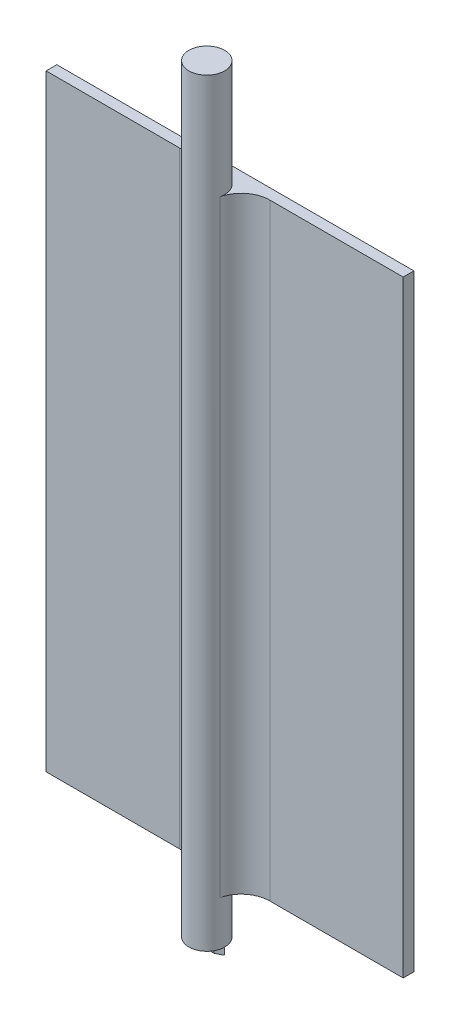
ISO-10303-21;
HEADER;
FILE_DESCRIPTION(('STEP AP214'),'2;1');
FILE_NAME('part.step','',(''),(''),'','','');
FILE_SCHEMA(('AUTOMOTIVE_DESIGN { 1 0 10303 214 1 1 1 1 }'));
ENDSEC;
DATA;
#1=APPLICATION_CONTEXT('core data for automotive mechanical design processes');
#2=APPLICATION_PROTOCOL_DEFINITION('international standard','automotive_design',2000,#1);
#3=PRODUCT_CONTEXT('',#1,'mechanical');
#4=PRODUCT('Part','Part','',(#3));
#5=PRODUCT_RELATED_PRODUCT_CATEGORY('part','',(#4));
#6=PRODUCT_DEFINITION_FORMATION('','',#4);
#7=PRODUCT_DEFINITION_CONTEXT('part definition',#1,'design');
#8=PRODUCT_DEFINITION('design','',#6,#7);
#9=PRODUCT_DEFINITION_SHAPE('','',#8);
#10=(LENGTH_UNIT() NAMED_UNIT(*) SI_UNIT(.MILLI.,.METRE.));
#11=(NAMED_UNIT(*) PLANE_ANGLE_UNIT() SI_UNIT($,.RADIAN.));
#12=(NAMED_UNIT(*) SI_UNIT($,.STERADIAN.) SOLID_ANGLE_UNIT());
#13=UNCERTAINTY_MEASURE_WITH_UNIT(LENGTH_MEASURE(1.E-05),#10,'distance_accuracy_value','');
#14=(GEOMETRIC_REPRESENTATION_CONTEXT(3) GLOBAL_UNCERTAINTY_ASSIGNED_CONTEXT((#13)) GLOBAL_UNIT_ASSIGNED_CONTEXT((#10,
#11,#12)) REPRESENTATION_CONTEXT('',''));
#15=CARTESIAN_POINT('',(0.,0.,0.));
#16=DIRECTION('',(0.,0.,1.));
#17=DIRECTION('',(1.,0.,0.));
#18=AXIS2_PLACEMENT_3D('',#15,#16,#17);
#19=CARTESIAN_POINT('',(50.,-12.5,8.));
#20=DIRECTION('',(0.,-1.,0.));
#21=DIRECTION('',(0.,0.,-1.));
#22=AXIS2_PLACEMENT_3D('',#19,#20,#21);
#23=PLANE('',#22);
#24=DIRECTION('',(-0.894427190999917,0.,0.447213595499956));
#25=VECTOR('',#24,1.);
#26=CARTESIAN_POINT('',(53.,-12.5,9.));
#27=LINE('',#26,#25);
#28=CARTESIAN_POINT('',(55.,-12.5,8.));
#29=VERTEX_POINT('',#28);
#30=CARTESIAN_POINT('',(53.,-12.5,9.));
#31=VERTEX_POINT('',#30);
#32=EDGE_CURVE('E170',#29,#31,#27,.T.);
#33=ORIENTED_EDGE('',*,*,#32,.F.);
#34=CARTESIAN_POINT('',(50.,-12.5,8.));
#35=DIRECTION('',(0.,-1.,0.));
#36=DIRECTION('',(0.,0.,-1.));
#37=AXIS2_PLACEMENT_3D('',#34,#35,#36);
#38=CIRCLE('',#37,5.);
#39=CARTESIAN_POINT('',(45.,-12.5,8.));
#40=VERTEX_POINT('',#39);
#41=EDGE_CURVE('E176',#29,#40,#38,.T.);
#42=ORIENTED_EDGE('',*,*,#41,.T.);
#43=DIRECTION('',(-0.894427190999916,0.,-0.447213595499957));
#44=VECTOR('',#43,1.);
#45=CARTESIAN_POINT('',(47.,-12.5,9.));
#46=LINE('',#45,#44);
#47=CARTESIAN_POINT('',(47.,-12.5,9.));
#48=VERTEX_POINT('',#47);
#49=EDGE_CURVE('E496',#48,#40,#46,.T.);
#50=ORIENTED_EDGE('',*,*,#49,.F.);
#51=DIRECTION('',(-1.,0.,0.));
#52=VECTOR('',#51,1.);
#53=CARTESIAN_POINT('',(47.,-12.5,9.));
#54=LINE('',#53,#52);
#55=EDGE_CURVE('E498',#31,#48,#54,.T.);
#56=ORIENTED_EDGE('',*,*,#55,.F.);
#57=EDGE_LOOP('',(#33,#42,#50,#56));
#58=FACE_BOUND('',#57,.T.);
#59=ADVANCED_FACE('F45',(#58),#23,.T.);
#60=CARTESIAN_POINT('',(0.,170.,3.));
#61=DIRECTION('',(0.,-1.,0.));
#62=DIRECTION('',(0.,0.,-1.));
#63=AXIS2_PLACEMENT_3D('',#60,#61,#62);
#64=PLANE('',#63);
#65=CARTESIAN_POINT('',(50.,170.,8.));
#66=DIRECTION('',(0.,1.,0.));
#67=DIRECTION('',(0.,0.,1.));
#68=AXIS2_PLACEMENT_3D('',#65,#66,#67);
#69=CIRCLE('',#68,5.);
#70=CARTESIAN_POINT('',(54.8650425541052,170.,9.15384615384615));
#71=VERTEX_POINT('',#70);
#72=CARTESIAN_POINT('',(45.1349574458948,170.,9.15384615384615));
#73=VERTEX_POINT('',#72);
#74=EDGE_CURVE('E184',#71,#73,#69,.T.);
#75=ORIENTED_EDGE('',*,*,#74,.F.);
#76=CARTESIAN_POINT('',(62.6491106406735,170.,11.));
#77=DIRECTION('',(0.,-1.,0.));
#78=DIRECTION('',(0.,0.,-1.));
#79=AXIS2_PLACEMENT_3D('',#76,#77,#78);
#80=CIRCLE('',#79,8.);
#81=CARTESIAN_POINT('',(62.6491106406735,170.,3.));
#82=VERTEX_POINT('',#81);
#83=EDGE_CURVE('E255',#71,#82,#80,.T.);
#84=ORIENTED_EDGE('',*,*,#83,.T.);
#85=DIRECTION('',(-1.,0.,0.));
#86=VECTOR('',#85,1.);
#87=CARTESIAN_POINT('',(0.,170.,3.));
#88=LINE('',#87,#86);
#89=CARTESIAN_POINT('',(100.,170.,3.));
#90=VERTEX_POINT('',#89);
#91=EDGE_CURVE('E211',#90,#82,#88,.T.);
#92=ORIENTED_EDGE('',*,*,#91,.F.);
#93=DIRECTION('',(0.,0.,-1.));
#94=VECTOR('',#93,1.);
#95=CARTESIAN_POINT('',(100.,170.,3.));
#96=LINE('',#95,#94);
#97=CARTESIAN_POINT('',(100.,170.,0.));
#98=VERTEX_POINT('',#97);
#99=EDGE_CURVE('E230',#90,#98,#96,.T.);
#100=ORIENTED_EDGE('',*,*,#99,.T.);
#101=DIRECTION('',(-1.,0.,0.));
#102=VECTOR('',#101,1.);
#103=CARTESIAN_POINT('',(0.,170.,0.));
#104=LINE('',#103,#102);
#105=CARTESIAN_POINT('',(0.,170.,0.));
#106=VERTEX_POINT('',#105);
#107=EDGE_CURVE('E202',#98,#106,#104,.T.);
#108=ORIENTED_EDGE('',*,*,#107,.T.);
#109=DIRECTION('',(0.,0.,-1.));
#110=VECTOR('',#109,1.);
#111=CARTESIAN_POINT('',(0.,170.,3.));
#112=LINE('',#111,#110);
#113=CARTESIAN_POINT('',(0.,170.,3.));
#114=VERTEX_POINT('',#113);
#115=EDGE_CURVE('E215',#114,#106,#112,.T.);
#116=ORIENTED_EDGE('',*,*,#115,.F.);
#117=CARTESIAN_POINT('',(37.3508893593265,170.,3.));
#118=VERTEX_POINT('',#117);
#119=EDGE_CURVE('E210',#118,#114,#88,.T.);
#120=ORIENTED_EDGE('',*,*,#119,.F.);
#121=CARTESIAN_POINT('',(37.3508893593265,170.,11.));
#122=DIRECTION('',(0.,-1.,0.));
#123=DIRECTION('',(0.,0.,-1.));
#124=AXIS2_PLACEMENT_3D('',#121,#122,#123);
#125=CIRCLE('',#124,8.);
#126=EDGE_CURVE('E54',#118,#73,#125,.T.);
#127=ORIENTED_EDGE('',*,*,#126,.T.);
#128=EDGE_LOOP('',(#75,#84,#92,#100,#108,#116,#120,#127));
#129=FACE_BOUND('',#128,.T.);
#130=ADVANCED_FACE('F266',(#129),#64,.F.);
#131=CARTESIAN_POINT('',(0.,0.,3.));
#132=DIRECTION('',(0.,0.,-1.));
#133=DIRECTION('',(-1.,0.,0.));
#134=AXIS2_PLACEMENT_3D('',#131,#132,#133);
#135=PLANE('',#134);
#136=ORIENTED_EDGE('',*,*,#91,.T.);
#137=DIRECTION('',(0.,1.,0.));
#138=VECTOR('',#137,1.);
#139=CARTESIAN_POINT('',(62.6491106406735,0.,3.));
#140=LINE('',#139,#138);
#141=CARTESIAN_POINT('',(62.6491106406735,0.,3.));
#142=VERTEX_POINT('',#141);
#143=EDGE_CURVE('E248',#82,#142,#140,.F.);
#144=ORIENTED_EDGE('',*,*,#143,.T.);
#145=DIRECTION('',(1.,0.,0.));
#146=VECTOR('',#145,1.);
#147=CARTESIAN_POINT('',(0.,0.,3.));
#148=LINE('',#147,#146);
#149=CARTESIAN_POINT('',(100.,0.,3.));
#150=VERTEX_POINT('',#149);
#151=EDGE_CURVE('E201',#142,#150,#148,.T.);
#152=ORIENTED_EDGE('',*,*,#151,.T.);
#153=DIRECTION('',(0.,1.,0.));
#154=VECTOR('',#153,1.);
#155=CARTESIAN_POINT('',(100.,0.,3.));
#156=LINE('',#155,#154);
#157=EDGE_CURVE('E207',#150,#90,#156,.T.);
#158=ORIENTED_EDGE('',*,*,#157,.T.);
#159=EDGE_LOOP('',(#136,#144,#152,#158));
#160=FACE_BOUND('',#159,.T.);
#161=ADVANCED_FACE('F282',(#160),#135,.F.);
#162=CARTESIAN_POINT('',(0.,0.,3.));
#163=DIRECTION('',(1.,0.,0.));
#164=DIRECTION('',(0.,0.,-1.));
#165=AXIS2_PLACEMENT_3D('',#162,#163,#164);
#166=PLANE('',#165);
#167=DIRECTION('',(0.,-1.,0.));
#168=VECTOR('',#167,1.);
#169=CARTESIAN_POINT('',(0.,0.,0.));
#170=LINE('',#169,#168);
#171=CARTESIAN_POINT('',(0.,0.,0.));
#172=VERTEX_POINT('',#171);
#173=EDGE_CURVE('E194',#106,#172,#170,.T.);
#174=ORIENTED_EDGE('',*,*,#173,.T.);
#175=DIRECTION('',(0.,0.,-1.));
#176=VECTOR('',#175,1.);
#177=CARTESIAN_POINT('',(0.,0.,3.));
#178=LINE('',#177,#176);
#179=CARTESIAN_POINT('',(0.,0.,3.));
#180=VERTEX_POINT('',#179);
#181=EDGE_CURVE('E189',#180,#172,#178,.T.);
#182=ORIENTED_EDGE('',*,*,#181,.F.);
#183=DIRECTION('',(0.,-1.,0.));
#184=VECTOR('',#183,1.);
#185=CARTESIAN_POINT('',(0.,0.,3.));
#186=LINE('',#185,#184);
#187=EDGE_CURVE('E197',#114,#180,#186,.T.);
#188=ORIENTED_EDGE('',*,*,#187,.F.);
#189=ORIENTED_EDGE('',*,*,#115,.T.);
#190=EDGE_LOOP('',(#174,#182,#188,#189));
#191=FACE_BOUND('',#190,.T.);
#192=ADVANCED_FACE('F296',(#191),#166,.F.);
#193=CARTESIAN_POINT('',(0.,0.,3.));
#194=DIRECTION('',(0.,1.,0.));
#195=DIRECTION('',(0.,0.,1.));
#196=AXIS2_PLACEMENT_3D('',#193,#194,#195);
#197=PLANE('',#196);
#198=CARTESIAN_POINT('',(50.,0.,8.));
#199=DIRECTION('',(0.,-1.,0.));
#200=DIRECTION('',(0.,0.,-1.));
#201=AXIS2_PLACEMENT_3D('',#198,#199,#200);
#202=CIRCLE('',#201,5.);
#203=CARTESIAN_POINT('',(45.1349574458948,0.,9.15384615384616));
#204=VERTEX_POINT('',#203);
#205=CARTESIAN_POINT('',(54.8650425541052,0.,9.15384615384615));
#206=VERTEX_POINT('',#205);
#207=EDGE_CURVE('E185',#204,#206,#202,.T.);
#208=ORIENTED_EDGE('',*,*,#207,.F.);
#209=CARTESIAN_POINT('',(37.3508893593265,0.,11.));
#210=DIRECTION('',(0.,1.,0.));
#211=DIRECTION('',(0.,0.,1.));
#212=AXIS2_PLACEMENT_3D('',#209,#210,#211);
#213=CIRCLE('',#212,8.);
#214=CARTESIAN_POINT('',(37.3508893593265,0.,3.));
#215=VERTEX_POINT('',#214);
#216=EDGE_CURVE('E11',#204,#215,#213,.T.);
#217=ORIENTED_EDGE('',*,*,#216,.T.);
#218=EDGE_CURVE('E203',#180,#215,#148,.T.);
#219=ORIENTED_EDGE('',*,*,#218,.F.);
#220=ORIENTED_EDGE('',*,*,#181,.T.);
#221=DIRECTION('',(1.,0.,0.));
#222=VECTOR('',#221,1.);
#223=CARTESIAN_POINT('',(0.,0.,0.));
#224=LINE('',#223,#222);
#225=CARTESIAN_POINT('',(100.,0.,0.));
#226=VERTEX_POINT('',#225);
#227=EDGE_CURVE('E219',#172,#226,#224,.T.);
#228=ORIENTED_EDGE('',*,*,#227,.T.);
#229=DIRECTION('',(0.,0.,-1.));
#230=VECTOR('',#229,1.);
#231=CARTESIAN_POINT('',(100.,0.,3.));
#232=LINE('',#231,#230);
#233=EDGE_CURVE('E234',#150,#226,#232,.T.);
#234=ORIENTED_EDGE('',*,*,#233,.F.);
#235=ORIENTED_EDGE('',*,*,#151,.F.);
#236=CARTESIAN_POINT('',(62.6491106406735,0.,11.));
#237=DIRECTION('',(0.,1.,0.));
#238=DIRECTION('',(0.,0.,1.));
#239=AXIS2_PLACEMENT_3D('',#236,#237,#238);
#240=CIRCLE('',#239,8.);
#241=EDGE_CURVE('E258',#142,#206,#240,.T.);
#242=ORIENTED_EDGE('',*,*,#241,.T.);
#243=EDGE_LOOP('',(#208,#217,#219,#220,#228,#234,#235,#242));
#244=FACE_BOUND('',#243,.T.);
#245=ADVANCED_FACE('F303',(#244),#197,.F.);
#246=CARTESIAN_POINT('',(100.,0.,3.));
#247=DIRECTION('',(-1.,0.,0.));
#248=DIRECTION('',(0.,0.,1.));
#249=AXIS2_PLACEMENT_3D('',#246,#247,#248);
#250=PLANE('',#249);
#251=DIRECTION('',(0.,1.,0.));
#252=VECTOR('',#251,1.);
#253=CARTESIAN_POINT('',(100.,0.,0.));
#254=LINE('',#253,#252);
#255=EDGE_CURVE('E222',#226,#98,#254,.T.);
#256=ORIENTED_EDGE('',*,*,#255,.T.);
#257=ORIENTED_EDGE('',*,*,#99,.F.);
#258=ORIENTED_EDGE('',*,*,#157,.F.);
#259=ORIENTED_EDGE('',*,*,#233,.T.);
#260=EDGE_LOOP('',(#256,#257,#258,#259));
#261=FACE_BOUND('',#260,.T.);
#262=ADVANCED_FACE('F288',(#261),#250,.F.);
#263=ORIENTED_EDGE('',*,*,#218,.T.);
#264=DIRECTION('',(0.,1.,0.));
#265=VECTOR('',#264,1.);
#266=CARTESIAN_POINT('',(37.3508893593265,0.,3.));
#267=LINE('',#266,#265);
#268=EDGE_CURVE('E251',#215,#118,#267,.T.);
#269=ORIENTED_EDGE('',*,*,#268,.T.);
#270=ORIENTED_EDGE('',*,*,#119,.T.);
#271=ORIENTED_EDGE('',*,*,#187,.T.);
#272=EDGE_LOOP('',(#263,#269,#270,#271));
#273=FACE_BOUND('',#272,.T.);
#274=ADVANCED_FACE('F299',(#273),#135,.F.);
#275=CARTESIAN_POINT('',(0.,0.,0.));
#276=DIRECTION('',(0.,0.,-1.));
#277=DIRECTION('',(-1.,0.,0.));
#278=AXIS2_PLACEMENT_3D('',#275,#276,#277);
#279=PLANE('',#278);
#280=ORIENTED_EDGE('',*,*,#173,.F.);
#281=ORIENTED_EDGE('',*,*,#107,.F.);
#282=ORIENTED_EDGE('',*,*,#255,.F.);
#283=ORIENTED_EDGE('',*,*,#227,.F.);
#284=EDGE_LOOP('',(#280,#281,#282,#283));
#285=FACE_BOUND('',#284,.T.);
#286=ADVANCED_FACE('F293',(#285),#279,.T.);
#287=CARTESIAN_POINT('',(50.,-14.142135623731,8.));
#288=DIRECTION('',(0.,1.,0.));
#289=DIRECTION('',(0.,0.,1.));
#290=AXIS2_PLACEMENT_3D('',#287,#288,#289);
#291=CYLINDRICAL_SURFACE('',#290,5.);
#292=DIRECTION('',(0.,1.,0.));
#293=VECTOR('',#292,1.);
#294=CARTESIAN_POINT('',(54.8650425541052,-14.142135623731,9.15384615384615));
#295=LINE('',#294,#293);
#296=EDGE_CURVE('E244',#206,#71,#295,.T.);
#297=ORIENTED_EDGE('',*,*,#296,.T.);
#298=ORIENTED_EDGE('',*,*,#74,.T.);
#299=DIRECTION('',(0.,1.,0.));
#300=VECTOR('',#299,1.);
#301=CARTESIAN_POINT('',(45.1349574458948,-14.142135623731,9.15384615384616));
#302=LINE('',#301,#300);
#303=EDGE_CURVE('E188',#73,#204,#302,.F.);
#304=ORIENTED_EDGE('',*,*,#303,.T.);
#305=ORIENTED_EDGE('',*,*,#207,.T.);
#306=EDGE_LOOP('',(#297,#298,#304,#305));
#307=FACE_BOUND('',#306,.T.);
#308=CARTESIAN_POINT('',(50.,200.,8.));
#309=DIRECTION('',(0.,1.,0.));
#310=DIRECTION('',(0.,0.,1.));
#311=AXIS2_PLACEMENT_3D('',#308,#309,#310);
#312=CIRCLE('',#311,5.);
#313=CARTESIAN_POINT('',(50.,200.,13.));
#314=VERTEX_POINT('',#313);
#315=EDGE_CURVE('E190',#314,#314,#312,.T.);
#316=ORIENTED_EDGE('',*,*,#315,.F.);
#317=EDGE_LOOP('',(#316));
#318=FACE_BOUND('',#317,.T.);
#319=ORIENTED_EDGE('',*,*,#41,.F.);
#320=EDGE_CURVE('E172',#40,#29,#38,.T.);
#321=ORIENTED_EDGE('',*,*,#320,.F.);
#322=EDGE_LOOP('',(#319,#321));
#323=FACE_BOUND('',#322,.T.);
#324=ADVANCED_FACE('F273',(#307,#318,#323),#291,.T.);
#325=CARTESIAN_POINT('',(50.,200.,8.));
#326=DIRECTION('',(0.,1.,0.));
#327=DIRECTION('',(0.,0.,1.));
#328=AXIS2_PLACEMENT_3D('',#325,#326,#327);
#329=PLANE('',#328);
#330=ORIENTED_EDGE('',*,*,#315,.T.);
#331=EDGE_LOOP('',(#330));
#332=FACE_BOUND('',#331,.T.);
#333=ADVANCED_FACE('F327',(#332),#329,.T.);
#334=DIRECTION('',(0.894427190999916,0.,0.447213595499957));
#335=VECTOR('',#334,1.);
#336=CARTESIAN_POINT('',(55.,-12.5,8.));
#337=LINE('',#336,#335);
#338=CARTESIAN_POINT('',(53.,-12.5,7.));
#339=VERTEX_POINT('',#338);
#340=EDGE_CURVE('E61',#339,#29,#337,.T.);
#341=ORIENTED_EDGE('',*,*,#340,.F.);
#342=DIRECTION('',(1.,0.,0.));
#343=VECTOR('',#342,1.);
#344=CARTESIAN_POINT('',(47.,-12.5,7.));
#345=LINE('',#344,#343);
#346=CARTESIAN_POINT('',(47.,-12.5,7.));
#347=VERTEX_POINT('',#346);
#348=EDGE_CURVE('E65',#347,#339,#345,.T.);
#349=ORIENTED_EDGE('',*,*,#348,.F.);
#350=DIRECTION('',(0.894427190999916,0.,-0.447213595499958));
#351=VECTOR('',#350,1.);
#352=CARTESIAN_POINT('',(45.,-12.5,8.));
#353=LINE('',#352,#351);
#354=EDGE_CURVE('E493',#40,#347,#353,.T.);
#355=ORIENTED_EDGE('',*,*,#354,.F.);
#356=ORIENTED_EDGE('',*,*,#320,.T.);
#357=EDGE_LOOP('',(#341,#349,#355,#356));
#358=FACE_BOUND('',#357,.T.);
#359=ADVANCED_FACE('F317',(#358),#23,.T.);
#360=CARTESIAN_POINT('',(62.6491106406735,-14.142135623731,11.));
#361=DIRECTION('',(0.,1.,0.));
#362=DIRECTION('',(0.,0.,1.));
#363=AXIS2_PLACEMENT_3D('',#360,#361,#362);
#364=CYLINDRICAL_SURFACE('',#363,8.);
#365=ORIENTED_EDGE('',*,*,#241,.F.);
#366=ORIENTED_EDGE('',*,*,#143,.F.);
#367=ORIENTED_EDGE('',*,*,#83,.F.);
#368=ORIENTED_EDGE('',*,*,#296,.F.);
#369=EDGE_LOOP('',(#365,#366,#367,#368));
#370=FACE_BOUND('',#369,.T.);
#371=ADVANCED_FACE('F278',(#370),#364,.F.);
#372=CARTESIAN_POINT('',(37.3508893593265,-14.142135623731,11.));
#373=DIRECTION('',(0.,1.,0.));
#374=DIRECTION('',(0.,0.,1.));
#375=AXIS2_PLACEMENT_3D('',#372,#373,#374);
#376=CYLINDRICAL_SURFACE('',#375,8.);
#377=ORIENTED_EDGE('',*,*,#216,.F.);
#378=ORIENTED_EDGE('',*,*,#303,.F.);
#379=ORIENTED_EDGE('',*,*,#126,.F.);
#380=ORIENTED_EDGE('',*,*,#268,.F.);
#381=EDGE_LOOP('',(#377,#378,#379,#380));
#382=FACE_BOUND('',#381,.T.);
#383=ADVANCED_FACE('F47',(#382),#376,.F.);
#384=CARTESIAN_POINT('',(53.,-14.5,9.));
#385=DIRECTION('',(-0.447213595499956,0.,-0.894427190999917));
#386=DIRECTION('',(-0.894427190999917,0.,0.447213595499956));
#387=AXIS2_PLACEMENT_3D('',#384,#385,#386);
#388=PLANE('',#387);
#389=ORIENTED_EDGE('',*,*,#32,.T.);
#390=DIRECTION('',(0.,1.,0.));
#391=VECTOR('',#390,1.);
#392=CARTESIAN_POINT('',(53.,-14.5,9.));
#393=LINE('',#392,#391);
#394=CARTESIAN_POINT('',(53.,-14.5,9.));
#395=VERTEX_POINT('',#394);
#396=EDGE_CURVE('E150',#395,#31,#393,.T.);
#397=ORIENTED_EDGE('',*,*,#396,.F.);
#398=DIRECTION('',(-0.894427190999917,0.,0.447213595499956));
#399=VECTOR('',#398,1.);
#400=CARTESIAN_POINT('',(53.,-14.5,9.));
#401=LINE('',#400,#399);
#402=CARTESIAN_POINT('',(55.,-14.5,8.));
#403=VERTEX_POINT('',#402);
#404=EDGE_CURVE('E158',#403,#395,#401,.T.);
#405=ORIENTED_EDGE('',*,*,#404,.F.);
#406=DIRECTION('',(0.,1.,0.));
#407=VECTOR('',#406,1.);
#408=CARTESIAN_POINT('',(55.,-14.5,8.));
#409=LINE('',#408,#407);
#410=EDGE_CURVE('E471',#403,#29,#409,.T.);
#411=ORIENTED_EDGE('',*,*,#410,.T.);
#412=EDGE_LOOP('',(#389,#397,#405,#411));
#413=FACE_BOUND('',#412,.T.);
#414=ADVANCED_FACE('F169',(#413),#388,.F.);
#415=CARTESIAN_POINT('',(47.,-14.5,9.));
#416=DIRECTION('',(0.,0.,-1.));
#417=DIRECTION('',(-1.,0.,0.));
#418=AXIS2_PLACEMENT_3D('',#415,#416,#417);
#419=PLANE('',#418);
#420=ORIENTED_EDGE('',*,*,#55,.T.);
#421=DIRECTION('',(0.,1.,0.));
#422=VECTOR('',#421,1.);
#423=CARTESIAN_POINT('',(47.,-14.5,9.));
#424=LINE('',#423,#422);
#425=CARTESIAN_POINT('',(47.,-14.5,9.));
#426=VERTEX_POINT('',#425);
#427=EDGE_CURVE('E153',#426,#48,#424,.T.);
#428=ORIENTED_EDGE('',*,*,#427,.F.);
#429=DIRECTION('',(-1.,0.,0.));
#430=VECTOR('',#429,1.);
#431=CARTESIAN_POINT('',(47.,-14.5,9.));
#432=LINE('',#431,#430);
#433=EDGE_CURVE('E145',#395,#426,#432,.T.);
#434=ORIENTED_EDGE('',*,*,#433,.F.);
#435=ORIENTED_EDGE('',*,*,#396,.T.);
#436=EDGE_LOOP('',(#420,#428,#434,#435));
#437=FACE_BOUND('',#436,.T.);
#438=ADVANCED_FACE('F148',(#437),#419,.F.);
#439=CARTESIAN_POINT('',(47.,-14.5,9.));
#440=DIRECTION('',(0.447213595499957,0.,-0.894427190999916));
#441=DIRECTION('',(-0.894427190999916,0.,-0.447213595499957));
#442=AXIS2_PLACEMENT_3D('',#439,#440,#441);
#443=PLANE('',#442);
#444=ORIENTED_EDGE('',*,*,#49,.T.);
#445=DIRECTION('',(0.,1.,0.));
#446=VECTOR('',#445,1.);
#447=CARTESIAN_POINT('',(45.,-14.5,8.));
#448=LINE('',#447,#446);
#449=CARTESIAN_POINT('',(45.,-14.5,8.));
#450=VERTEX_POINT('',#449);
#451=EDGE_CURVE('E178',#450,#40,#448,.T.);
#452=ORIENTED_EDGE('',*,*,#451,.F.);
#453=DIRECTION('',(-0.894427190999916,0.,-0.447213595499957));
#454=VECTOR('',#453,1.);
#455=CARTESIAN_POINT('',(47.,-14.5,9.));
#456=LINE('',#455,#454);
#457=EDGE_CURVE('E157',#426,#450,#456,.T.);
#458=ORIENTED_EDGE('',*,*,#457,.F.);
#459=ORIENTED_EDGE('',*,*,#427,.T.);
#460=EDGE_LOOP('',(#444,#452,#458,#459));
#461=FACE_BOUND('',#460,.T.);
#462=ADVANCED_FACE('F418',(#461),#443,.F.);
#463=CARTESIAN_POINT('',(45.,-14.5,8.));
#464=DIRECTION('',(0.447213595499958,0.,0.894427190999916));
#465=DIRECTION('',(0.894427190999916,0.,-0.447213595499958));
#466=AXIS2_PLACEMENT_3D('',#463,#464,#465);
#467=PLANE('',#466);
#468=ORIENTED_EDGE('',*,*,#354,.T.);
#469=DIRECTION('',(0.,1.,0.));
#470=VECTOR('',#469,1.);
#471=CARTESIAN_POINT('',(47.,-14.5,7.));
#472=LINE('',#471,#470);
#473=CARTESIAN_POINT('',(47.,-14.5,7.));
#474=VERTEX_POINT('',#473);
#475=EDGE_CURVE('E480',#474,#347,#472,.T.);
#476=ORIENTED_EDGE('',*,*,#475,.F.);
#477=DIRECTION('',(0.894427190999916,0.,-0.447213595499958));
#478=VECTOR('',#477,1.);
#479=CARTESIAN_POINT('',(45.,-14.5,8.));
#480=LINE('',#479,#478);
#481=EDGE_CURVE('E494',#450,#474,#480,.T.);
#482=ORIENTED_EDGE('',*,*,#481,.F.);
#483=ORIENTED_EDGE('',*,*,#451,.T.);
#484=EDGE_LOOP('',(#468,#476,#482,#483));
#485=FACE_BOUND('',#484,.T.);
#486=ADVANCED_FACE('F426',(#485),#467,.F.);
#487=CARTESIAN_POINT('',(47.,-14.5,7.));
#488=DIRECTION('',(0.,0.,1.));
#489=DIRECTION('',(1.,0.,0.));
#490=AXIS2_PLACEMENT_3D('',#487,#488,#489);
#491=PLANE('',#490);
#492=ORIENTED_EDGE('',*,*,#348,.T.);
#493=DIRECTION('',(0.,1.,0.));
#494=VECTOR('',#493,1.);
#495=CARTESIAN_POINT('',(53.,-14.5,7.));
#496=LINE('',#495,#494);
#497=CARTESIAN_POINT('',(53.,-14.5,7.));
#498=VERTEX_POINT('',#497);
#499=EDGE_CURVE('E473',#498,#339,#496,.T.);
#500=ORIENTED_EDGE('',*,*,#499,.F.);
#501=DIRECTION('',(1.,0.,0.));
#502=VECTOR('',#501,1.);
#503=CARTESIAN_POINT('',(47.,-14.5,7.));
#504=LINE('',#503,#502);
#505=EDGE_CURVE('E482',#474,#498,#504,.T.);
#506=ORIENTED_EDGE('',*,*,#505,.F.);
#507=ORIENTED_EDGE('',*,*,#475,.T.);
#508=EDGE_LOOP('',(#492,#500,#506,#507));
#509=FACE_BOUND('',#508,.T.);
#510=ADVANCED_FACE('F435',(#509),#491,.F.);
#511=CARTESIAN_POINT('',(55.,-14.5,8.));
#512=DIRECTION('',(-0.447213595499957,0.,0.894427190999917));
#513=DIRECTION('',(0.894427190999917,0.,0.447213595499957));
#514=AXIS2_PLACEMENT_3D('',#511,#512,#513);
#515=PLANE('',#514);
#516=ORIENTED_EDGE('',*,*,#340,.T.);
#517=ORIENTED_EDGE('',*,*,#410,.F.);
#518=DIRECTION('',(0.894427190999916,0.,0.447213595499957));
#519=VECTOR('',#518,1.);
#520=CARTESIAN_POINT('',(55.,-14.5,8.));
#521=LINE('',#520,#519);
#522=EDGE_CURVE('E163',#498,#403,#521,.T.);
#523=ORIENTED_EDGE('',*,*,#522,.F.);
#524=ORIENTED_EDGE('',*,*,#499,.T.);
#525=EDGE_LOOP('',(#516,#517,#523,#524));
#526=FACE_BOUND('',#525,.T.);
#527=ADVANCED_FACE('F444',(#526),#515,.F.);
#528=CARTESIAN_POINT('',(0.,-14.5,0.));
#529=DIRECTION('',(0.,1.,0.));
#530=DIRECTION('',(0.,0.,1.));
#531=AXIS2_PLACEMENT_3D('',#528,#529,#530);
#532=PLANE('',#531);
#533=ORIENTED_EDGE('',*,*,#404,.T.);
#534=ORIENTED_EDGE('',*,*,#433,.T.);
#535=ORIENTED_EDGE('',*,*,#457,.T.);
#536=ORIENTED_EDGE('',*,*,#481,.T.);
#537=ORIENTED_EDGE('',*,*,#505,.T.);
#538=ORIENTED_EDGE('',*,*,#522,.T.);
#539=EDGE_LOOP('',(#533,#534,#535,#536,#537,#538));
#540=FACE_BOUND('',#539,.T.);
#541=ADVANCED_FACE('F161',(#540),#532,.F.);
#542=CLOSED_SHELL('',(#59,#130,#161,#192,#245,#262,#274,#286,#324,#333,#359,#371,#383,#414,#438,
#462,#486,#510,#527,#541));
#543=MANIFOLD_SOLID_BREP('B2',#542);
#544=ADVANCED_BREP_SHAPE_REPRESENTATION('',(#18,#543),#14);
#545=SHAPE_DEFINITION_REPRESENTATION(#9,#544);
ENDSEC;
END-ISO-10303-21;
